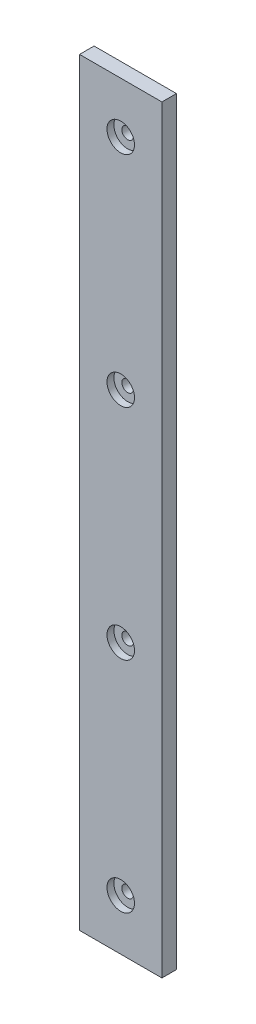
ISO-10303-21;
HEADER;
FILE_DESCRIPTION(('STEP AP214'),'2;1');
FILE_NAME('part.step','',(''),(''),'','','');
FILE_SCHEMA(('AUTOMOTIVE_DESIGN { 1 0 10303 214 1 1 1 1 }'));
ENDSEC;
DATA;
#1=APPLICATION_CONTEXT('core data for automotive mechanical design processes');
#2=APPLICATION_PROTOCOL_DEFINITION('international standard','automotive_design',2000,#1);
#3=PRODUCT_CONTEXT('',#1,'mechanical');
#4=PRODUCT('Part','Part','',(#3));
#5=PRODUCT_RELATED_PRODUCT_CATEGORY('part','',(#4));
#6=PRODUCT_DEFINITION_FORMATION('','',#4);
#7=PRODUCT_DEFINITION_CONTEXT('part definition',#1,'design');
#8=PRODUCT_DEFINITION('design','',#6,#7);
#9=PRODUCT_DEFINITION_SHAPE('','',#8);
#10=(LENGTH_UNIT() NAMED_UNIT(*) SI_UNIT(.MILLI.,.METRE.));
#11=(NAMED_UNIT(*) PLANE_ANGLE_UNIT() SI_UNIT($,.RADIAN.));
#12=(NAMED_UNIT(*) SI_UNIT($,.STERADIAN.) SOLID_ANGLE_UNIT());
#13=UNCERTAINTY_MEASURE_WITH_UNIT(LENGTH_MEASURE(1.E-05),#10,'distance_accuracy_value','');
#14=(GEOMETRIC_REPRESENTATION_CONTEXT(3) GLOBAL_UNCERTAINTY_ASSIGNED_CONTEXT((#13)) GLOBAL_UNIT_ASSIGNED_CONTEXT((#10,
#11,#12)) REPRESENTATION_CONTEXT('',''));
#15=CARTESIAN_POINT('',(0.,0.,0.));
#16=DIRECTION('',(0.,0.,1.));
#17=DIRECTION('',(1.,0.,0.));
#18=AXIS2_PLACEMENT_3D('',#15,#16,#17);
#19=CARTESIAN_POINT('',(0.,151.5,6.7));
#20=DIRECTION('',(0.,0.,-1.));
#21=DIRECTION('',(0.,1.,0.));
#22=AXIS2_PLACEMENT_3D('',#19,#20,#21);
#23=CYLINDRICAL_SURFACE('',#22,6.35);
#24=CARTESIAN_POINT('',(0.,151.5,3.5));
#25=DIRECTION('',(0.,0.,-1.));
#26=DIRECTION('',(0.,1.,0.));
#27=AXIS2_PLACEMENT_3D('',#24,#25,#26);
#28=CIRCLE('',#27,6.35);
#29=CARTESIAN_POINT('',(0.,157.85,3.5));
#30=VERTEX_POINT('',#29);
#31=EDGE_CURVE('E114',#30,#30,#28,.T.);
#32=ORIENTED_EDGE('',*,*,#31,.T.);
#33=EDGE_LOOP('',(#32));
#34=FACE_BOUND('',#33,.T.);
#35=CARTESIAN_POINT('',(0.,151.5,6.7));
#36=DIRECTION('',(0.,0.,-1.));
#37=DIRECTION('',(0.,1.,0.));
#38=AXIS2_PLACEMENT_3D('',#35,#36,#37);
#39=CIRCLE('',#38,6.35);
#40=CARTESIAN_POINT('',(0.,157.85,6.7));
#41=VERTEX_POINT('',#40);
#42=EDGE_CURVE('E19',#41,#41,#39,.T.);
#43=ORIENTED_EDGE('',*,*,#42,.F.);
#44=EDGE_LOOP('',(#43));
#45=FACE_BOUND('',#44,.T.);
#46=ADVANCED_FACE('F15',(#34,#45),#23,.F.);
#47=CARTESIAN_POINT('',(0.,50.5,6.7));
#48=DIRECTION('',(0.,0.,-1.));
#49=DIRECTION('',(-1.,0.,0.));
#50=AXIS2_PLACEMENT_3D('',#47,#48,#49);
#51=CYLINDRICAL_SURFACE('',#50,6.35);
#52=CARTESIAN_POINT('',(0.,50.5,3.5));
#53=DIRECTION('',(0.,0.,-1.));
#54=DIRECTION('',(-1.,0.,0.));
#55=AXIS2_PLACEMENT_3D('',#52,#53,#54);
#56=CIRCLE('',#55,6.35);
#57=CARTESIAN_POINT('',(-6.35000000000005,50.5,3.5));
#58=VERTEX_POINT('',#57);
#59=EDGE_CURVE('E111',#58,#58,#56,.T.);
#60=ORIENTED_EDGE('',*,*,#59,.T.);
#61=EDGE_LOOP('',(#60));
#62=FACE_BOUND('',#61,.T.);
#63=CARTESIAN_POINT('',(0.,50.5,6.7));
#64=DIRECTION('',(0.,0.,-1.));
#65=DIRECTION('',(-1.,0.,0.));
#66=AXIS2_PLACEMENT_3D('',#63,#64,#65);
#67=CIRCLE('',#66,6.35);
#68=CARTESIAN_POINT('',(-6.35000000000005,50.5,6.7));
#69=VERTEX_POINT('',#68);
#70=EDGE_CURVE('E122',#69,#69,#67,.T.);
#71=ORIENTED_EDGE('',*,*,#70,.F.);
#72=EDGE_LOOP('',(#71));
#73=FACE_BOUND('',#72,.T.);
#74=ADVANCED_FACE('F131',(#62,#73),#51,.F.);
#75=CARTESIAN_POINT('',(0.,-50.5,6.7));
#76=DIRECTION('',(0.,0.,-1.));
#77=DIRECTION('',(-1.,0.,0.));
#78=AXIS2_PLACEMENT_3D('',#75,#76,#77);
#79=CYLINDRICAL_SURFACE('',#78,6.35000000000001);
#80=CARTESIAN_POINT('',(0.,-50.5,3.5));
#81=DIRECTION('',(0.,0.,-1.));
#82=DIRECTION('',(-1.,0.,0.));
#83=AXIS2_PLACEMENT_3D('',#80,#81,#82);
#84=CIRCLE('',#83,6.35000000000001);
#85=CARTESIAN_POINT('',(-6.35000000000005,-50.5,3.5));
#86=VERTEX_POINT('',#85);
#87=EDGE_CURVE('E108',#86,#86,#84,.T.);
#88=ORIENTED_EDGE('',*,*,#87,.T.);
#89=EDGE_LOOP('',(#88));
#90=FACE_BOUND('',#89,.T.);
#91=CARTESIAN_POINT('',(0.,-50.5,6.7));
#92=DIRECTION('',(0.,0.,-1.));
#93=DIRECTION('',(-1.,0.,0.));
#94=AXIS2_PLACEMENT_3D('',#91,#92,#93);
#95=CIRCLE('',#94,6.35000000000001);
#96=CARTESIAN_POINT('',(-6.35000000000005,-50.5,6.7));
#97=VERTEX_POINT('',#96);
#98=EDGE_CURVE('E120',#97,#97,#95,.T.);
#99=ORIENTED_EDGE('',*,*,#98,.F.);
#100=EDGE_LOOP('',(#99));
#101=FACE_BOUND('',#100,.T.);
#102=ADVANCED_FACE('F138',(#90,#101),#79,.F.);
#103=CARTESIAN_POINT('',(0.,-151.5,6.7));
#104=DIRECTION('',(0.,0.,-1.));
#105=DIRECTION('',(0.,1.,0.));
#106=AXIS2_PLACEMENT_3D('',#103,#104,#105);
#107=CYLINDRICAL_SURFACE('',#106,6.34999999999999);
#108=CARTESIAN_POINT('',(0.,-151.5,3.5));
#109=DIRECTION('',(0.,0.,-1.));
#110=DIRECTION('',(0.,1.,0.));
#111=AXIS2_PLACEMENT_3D('',#108,#109,#110);
#112=CIRCLE('',#111,6.34999999999999);
#113=CARTESIAN_POINT('',(0.,-145.15,3.5));
#114=VERTEX_POINT('',#113);
#115=EDGE_CURVE('E75',#114,#114,#112,.T.);
#116=ORIENTED_EDGE('',*,*,#115,.T.);
#117=EDGE_LOOP('',(#116));
#118=FACE_BOUND('',#117,.T.);
#119=CARTESIAN_POINT('',(0.,-151.5,6.7));
#120=DIRECTION('',(0.,0.,-1.));
#121=DIRECTION('',(0.,1.,0.));
#122=AXIS2_PLACEMENT_3D('',#119,#120,#121);
#123=CIRCLE('',#122,6.34999999999999);
#124=CARTESIAN_POINT('',(0.,-145.15,6.7));
#125=VERTEX_POINT('',#124);
#126=EDGE_CURVE('E117',#125,#125,#123,.T.);
#127=ORIENTED_EDGE('',*,*,#126,.F.);
#128=EDGE_LOOP('',(#127));
#129=FACE_BOUND('',#128,.T.);
#130=ADVANCED_FACE('F167',(#118,#129),#107,.F.);
#131=CARTESIAN_POINT('',(0.,0.,6.7));
#132=DIRECTION('',(0.,0.,1.));
#133=DIRECTION('',(1.,0.,0.));
#134=AXIS2_PLACEMENT_3D('',#131,#132,#133);
#135=PLANE('',#134);
#136=ORIENTED_EDGE('',*,*,#126,.T.);
#137=EDGE_LOOP('',(#136));
#138=FACE_BOUND('',#137,.T.);
#139=ORIENTED_EDGE('',*,*,#98,.T.);
#140=EDGE_LOOP('',(#139));
#141=FACE_BOUND('',#140,.T.);
#142=ORIENTED_EDGE('',*,*,#70,.T.);
#143=EDGE_LOOP('',(#142));
#144=FACE_BOUND('',#143,.T.);
#145=ORIENTED_EDGE('',*,*,#42,.T.);
#146=EDGE_LOOP('',(#145));
#147=FACE_BOUND('',#146,.T.);
#148=DIRECTION('',(0.,1.,0.));
#149=VECTOR('',#148,1.);
#150=CARTESIAN_POINT('',(18.9999999999999,175.,6.7));
#151=LINE('',#150,#149);
#152=CARTESIAN_POINT('',(19.,175.,6.7));
#153=VERTEX_POINT('',#152);
#154=CARTESIAN_POINT('',(19.,-175.,6.7));
#155=VERTEX_POINT('',#154);
#156=EDGE_CURVE('E67',#153,#155,#151,.F.);
#157=ORIENTED_EDGE('',*,*,#156,.F.);
#158=DIRECTION('',(1.,0.,0.));
#159=VECTOR('',#158,1.);
#160=CARTESIAN_POINT('',(-19.,175.,6.7));
#161=LINE('',#160,#159);
#162=CARTESIAN_POINT('',(-19.,175.,6.7));
#163=VERTEX_POINT('',#162);
#164=EDGE_CURVE('E58',#163,#153,#161,.T.);
#165=ORIENTED_EDGE('',*,*,#164,.F.);
#166=DIRECTION('',(0.,1.,0.));
#167=VECTOR('',#166,1.);
#168=CARTESIAN_POINT('',(-19.,-175.,6.7));
#169=LINE('',#168,#167);
#170=CARTESIAN_POINT('',(-19.,-175.,6.7));
#171=VERTEX_POINT('',#170);
#172=EDGE_CURVE('E53',#171,#163,#169,.T.);
#173=ORIENTED_EDGE('',*,*,#172,.F.);
#174=DIRECTION('',(1.,0.,0.));
#175=VECTOR('',#174,1.);
#176=CARTESIAN_POINT('',(19.,-175.,6.7));
#177=LINE('',#176,#175);
#178=EDGE_CURVE('E71',#155,#171,#177,.F.);
#179=ORIENTED_EDGE('',*,*,#178,.F.);
#180=EDGE_LOOP('',(#157,#165,#173,#179));
#181=FACE_BOUND('',#180,.T.);
#182=ADVANCED_FACE('F70',(#138,#141,#144,#147,#181),#135,.T.);
#183=CARTESIAN_POINT('',(-6.47700000000005,157.977,3.5));
#184=DIRECTION('',(0.,0.,-1.));
#185=DIRECTION('',(1.,0.,0.));
#186=AXIS2_PLACEMENT_3D('',#183,#184,#185);
#187=PLANE('',#186);
#188=CARTESIAN_POINT('',(0.,151.5,3.5));
#189=DIRECTION('',(0.,0.,-1.));
#190=DIRECTION('',(0.,1.,0.));
#191=AXIS2_PLACEMENT_3D('',#188,#189,#190);
#192=CIRCLE('',#191,2.69999999999999);
#193=CARTESIAN_POINT('',(0.,154.2,3.5));
#194=VERTEX_POINT('',#193);
#195=EDGE_CURVE('E102',#194,#194,#192,.T.);
#196=ORIENTED_EDGE('',*,*,#195,.T.);
#197=EDGE_LOOP('',(#196));
#198=FACE_BOUND('',#197,.T.);
#199=ORIENTED_EDGE('',*,*,#31,.F.);
#200=EDGE_LOOP('',(#199));
#201=FACE_BOUND('',#200,.T.);
#202=ADVANCED_FACE('F166',(#198,#201),#187,.F.);
#203=CARTESIAN_POINT('',(-6.47700000000005,56.977,3.5));
#204=DIRECTION('',(0.,0.,-1.));
#205=DIRECTION('',(1.,0.,0.));
#206=AXIS2_PLACEMENT_3D('',#203,#204,#205);
#207=PLANE('',#206);
#208=CARTESIAN_POINT('',(0.,50.5,3.5));
#209=DIRECTION('',(0.,0.,-1.));
#210=DIRECTION('',(-1.,0.,0.));
#211=AXIS2_PLACEMENT_3D('',#208,#209,#210);
#212=CIRCLE('',#211,2.7);
#213=CARTESIAN_POINT('',(-2.70000000000006,50.5,3.5));
#214=VERTEX_POINT('',#213);
#215=EDGE_CURVE('E99',#214,#214,#212,.T.);
#216=ORIENTED_EDGE('',*,*,#215,.T.);
#217=EDGE_LOOP('',(#216));
#218=FACE_BOUND('',#217,.T.);
#219=ORIENTED_EDGE('',*,*,#59,.F.);
#220=EDGE_LOOP('',(#219));
#221=FACE_BOUND('',#220,.T.);
#222=ADVANCED_FACE('F173',(#218,#221),#207,.F.);
#223=CARTESIAN_POINT('',(-6.47700000000005,-44.023,3.5));
#224=DIRECTION('',(0.,0.,-1.));
#225=DIRECTION('',(1.,0.,0.));
#226=AXIS2_PLACEMENT_3D('',#223,#224,#225);
#227=PLANE('',#226);
#228=CARTESIAN_POINT('',(0.,-50.5,3.5));
#229=DIRECTION('',(0.,0.,-1.));
#230=DIRECTION('',(-1.,0.,0.));
#231=AXIS2_PLACEMENT_3D('',#228,#229,#230);
#232=CIRCLE('',#231,2.70000000000001);
#233=CARTESIAN_POINT('',(-2.70000000000005,-50.5,3.5));
#234=VERTEX_POINT('',#233);
#235=EDGE_CURVE('E96',#234,#234,#232,.T.);
#236=ORIENTED_EDGE('',*,*,#235,.T.);
#237=EDGE_LOOP('',(#236));
#238=FACE_BOUND('',#237,.T.);
#239=ORIENTED_EDGE('',*,*,#87,.F.);
#240=EDGE_LOOP('',(#239));
#241=FACE_BOUND('',#240,.T.);
#242=ADVANCED_FACE('F190',(#238,#241),#227,.F.);
#243=CARTESIAN_POINT('',(-6.47700000000005,-145.023,3.5));
#244=DIRECTION('',(0.,0.,-1.));
#245=DIRECTION('',(1.,0.,0.));
#246=AXIS2_PLACEMENT_3D('',#243,#244,#245);
#247=PLANE('',#246);
#248=CARTESIAN_POINT('',(0.,-151.5,3.5));
#249=DIRECTION('',(0.,0.,-1.));
#250=DIRECTION('',(-1.,0.,0.));
#251=AXIS2_PLACEMENT_3D('',#248,#249,#250);
#252=CIRCLE('',#251,2.70000000000001);
#253=CARTESIAN_POINT('',(-2.70000000000006,-151.5,3.5));
#254=VERTEX_POINT('',#253);
#255=EDGE_CURVE('E93',#254,#254,#252,.T.);
#256=ORIENTED_EDGE('',*,*,#255,.T.);
#257=EDGE_LOOP('',(#256));
#258=FACE_BOUND('',#257,.T.);
#259=ORIENTED_EDGE('',*,*,#115,.F.);
#260=EDGE_LOOP('',(#259));
#261=FACE_BOUND('',#260,.T.);
#262=ADVANCED_FACE('F164',(#258,#261),#247,.F.);
#263=CARTESIAN_POINT('',(18.9999999999999,175.,0.));
#264=DIRECTION('',(1.,0.,0.));
#265=DIRECTION('',(0.,0.,-1.));
#266=AXIS2_PLACEMENT_3D('',#263,#264,#265);
#267=PLANE('',#266);
#268=DIRECTION('',(0.,1.,0.));
#269=VECTOR('',#268,1.);
#270=CARTESIAN_POINT('',(19.,0.,0.));
#271=LINE('',#270,#269);
#272=CARTESIAN_POINT('',(19.,-175.,0.));
#273=VERTEX_POINT('',#272);
#274=CARTESIAN_POINT('',(19.,175.,0.));
#275=VERTEX_POINT('',#274);
#276=EDGE_CURVE('E79',#273,#275,#271,.T.);
#277=ORIENTED_EDGE('',*,*,#276,.T.);
#278=DIRECTION('',(0.,0.,1.));
#279=VECTOR('',#278,1.);
#280=CARTESIAN_POINT('',(18.9999999999999,175.,0.));
#281=LINE('',#280,#279);
#282=EDGE_CURVE('E63',#153,#275,#281,.F.);
#283=ORIENTED_EDGE('',*,*,#282,.F.);
#284=ORIENTED_EDGE('',*,*,#156,.T.);
#285=DIRECTION('',(0.,0.,-1.));
#286=VECTOR('',#285,1.);
#287=CARTESIAN_POINT('',(19.,-175.,0.));
#288=LINE('',#287,#286);
#289=EDGE_CURVE('E105',#273,#155,#288,.F.);
#290=ORIENTED_EDGE('',*,*,#289,.F.);
#291=EDGE_LOOP('',(#277,#283,#284,#290));
#292=FACE_BOUND('',#291,.T.);
#293=ADVANCED_FACE('F78',(#292),#267,.T.);
#294=CARTESIAN_POINT('',(-19.,175.,0.));
#295=DIRECTION('',(0.,1.,0.));
#296=DIRECTION('',(0.,0.,1.));
#297=AXIS2_PLACEMENT_3D('',#294,#295,#296);
#298=PLANE('',#297);
#299=DIRECTION('',(1.,0.,0.));
#300=VECTOR('',#299,1.);
#301=CARTESIAN_POINT('',(0.,175.,0.));
#302=LINE('',#301,#300);
#303=CARTESIAN_POINT('',(-19.,175.,0.));
#304=VERTEX_POINT('',#303);
#305=EDGE_CURVE('E219',#275,#304,#302,.F.);
#306=ORIENTED_EDGE('',*,*,#305,.T.);
#307=DIRECTION('',(0.,0.,1.));
#308=VECTOR('',#307,1.);
#309=CARTESIAN_POINT('',(-19.,175.,0.));
#310=LINE('',#309,#308);
#311=EDGE_CURVE('E65',#163,#304,#310,.F.);
#312=ORIENTED_EDGE('',*,*,#311,.F.);
#313=ORIENTED_EDGE('',*,*,#164,.T.);
#314=ORIENTED_EDGE('',*,*,#282,.T.);
#315=EDGE_LOOP('',(#306,#312,#313,#314));
#316=FACE_BOUND('',#315,.T.);
#317=ADVANCED_FACE('F61',(#316),#298,.T.);
#318=CARTESIAN_POINT('',(-19.,-175.,0.));
#319=DIRECTION('',(-1.,0.,0.));
#320=DIRECTION('',(0.,0.,1.));
#321=AXIS2_PLACEMENT_3D('',#318,#319,#320);
#322=PLANE('',#321);
#323=DIRECTION('',(0.,1.,0.));
#324=VECTOR('',#323,1.);
#325=CARTESIAN_POINT('',(-19.,0.,0.));
#326=LINE('',#325,#324);
#327=CARTESIAN_POINT('',(-19.,-175.,0.));
#328=VERTEX_POINT('',#327);
#329=EDGE_CURVE('E218',#304,#328,#326,.F.);
#330=ORIENTED_EDGE('',*,*,#329,.T.);
#331=DIRECTION('',(0.,0.,-1.));
#332=VECTOR('',#331,1.);
#333=CARTESIAN_POINT('',(-19.,-175.,0.));
#334=LINE('',#333,#332);
#335=EDGE_CURVE('E34',#171,#328,#334,.T.);
#336=ORIENTED_EDGE('',*,*,#335,.F.);
#337=ORIENTED_EDGE('',*,*,#172,.T.);
#338=ORIENTED_EDGE('',*,*,#311,.T.);
#339=EDGE_LOOP('',(#330,#336,#337,#338));
#340=FACE_BOUND('',#339,.T.);
#341=ADVANCED_FACE('F158',(#340),#322,.T.);
#342=CARTESIAN_POINT('',(19.,-175.,0.));
#343=DIRECTION('',(0.,-1.,0.));
#344=DIRECTION('',(0.,0.,-1.));
#345=AXIS2_PLACEMENT_3D('',#342,#343,#344);
#346=PLANE('',#345);
#347=DIRECTION('',(1.,0.,0.));
#348=VECTOR('',#347,1.);
#349=CARTESIAN_POINT('',(0.,-175.,0.));
#350=LINE('',#349,#348);
#351=EDGE_CURVE('E92',#328,#273,#350,.T.);
#352=ORIENTED_EDGE('',*,*,#351,.T.);
#353=ORIENTED_EDGE('',*,*,#289,.T.);
#354=ORIENTED_EDGE('',*,*,#178,.T.);
#355=ORIENTED_EDGE('',*,*,#335,.T.);
#356=EDGE_LOOP('',(#352,#353,#354,#355));
#357=FACE_BOUND('',#356,.T.);
#358=ADVANCED_FACE('F154',(#357),#346,.T.);
#359=CARTESIAN_POINT('',(0.,151.5,3.5));
#360=DIRECTION('',(0.,0.,-1.));
#361=DIRECTION('',(0.,1.,0.));
#362=AXIS2_PLACEMENT_3D('',#359,#360,#361);
#363=CYLINDRICAL_SURFACE('',#362,2.69999999999999);
#364=ORIENTED_EDGE('',*,*,#195,.F.);
#365=EDGE_LOOP('',(#364));
#366=FACE_BOUND('',#365,.T.);
#367=CARTESIAN_POINT('',(0.,151.5,0.));
#368=DIRECTION('',(0.,0.,-1.));
#369=DIRECTION('',(0.,1.,0.));
#370=AXIS2_PLACEMENT_3D('',#367,#368,#369);
#371=CIRCLE('',#370,2.69999999999999);
#372=CARTESIAN_POINT('',(0.,154.2,0.));
#373=VERTEX_POINT('',#372);
#374=EDGE_CURVE('E89',#373,#373,#371,.T.);
#375=ORIENTED_EDGE('',*,*,#374,.T.);
#376=EDGE_LOOP('',(#375));
#377=FACE_BOUND('',#376,.T.);
#378=ADVANCED_FACE('F157',(#366,#377),#363,.F.);
#379=CARTESIAN_POINT('',(0.,50.5,3.5));
#380=DIRECTION('',(0.,0.,-1.));
#381=DIRECTION('',(-1.,0.,0.));
#382=AXIS2_PLACEMENT_3D('',#379,#380,#381);
#383=CYLINDRICAL_SURFACE('',#382,2.7);
#384=ORIENTED_EDGE('',*,*,#215,.F.);
#385=EDGE_LOOP('',(#384));
#386=FACE_BOUND('',#385,.T.);
#387=CARTESIAN_POINT('',(0.,50.5,0.));
#388=DIRECTION('',(0.,0.,-1.));
#389=DIRECTION('',(-1.,0.,0.));
#390=AXIS2_PLACEMENT_3D('',#387,#388,#389);
#391=CIRCLE('',#390,2.7);
#392=CARTESIAN_POINT('',(-2.70000000000006,50.5,0.));
#393=VERTEX_POINT('',#392);
#394=EDGE_CURVE('E86',#393,#393,#391,.T.);
#395=ORIENTED_EDGE('',*,*,#394,.T.);
#396=EDGE_LOOP('',(#395));
#397=FACE_BOUND('',#396,.T.);
#398=ADVANCED_FACE('F200',(#386,#397),#383,.F.);
#399=CARTESIAN_POINT('',(0.,-50.5,3.5));
#400=DIRECTION('',(0.,0.,-1.));
#401=DIRECTION('',(-1.,0.,0.));
#402=AXIS2_PLACEMENT_3D('',#399,#400,#401);
#403=CYLINDRICAL_SURFACE('',#402,2.70000000000001);
#404=ORIENTED_EDGE('',*,*,#235,.F.);
#405=EDGE_LOOP('',(#404));
#406=FACE_BOUND('',#405,.T.);
#407=CARTESIAN_POINT('',(0.,-50.5,0.));
#408=DIRECTION('',(0.,0.,-1.));
#409=DIRECTION('',(-1.,0.,0.));
#410=AXIS2_PLACEMENT_3D('',#407,#408,#409);
#411=CIRCLE('',#410,2.70000000000001);
#412=CARTESIAN_POINT('',(-2.70000000000005,-50.5,0.));
#413=VERTEX_POINT('',#412);
#414=EDGE_CURVE('E25',#413,#413,#411,.T.);
#415=ORIENTED_EDGE('',*,*,#414,.T.);
#416=EDGE_LOOP('',(#415));
#417=FACE_BOUND('',#416,.T.);
#418=ADVANCED_FACE('F149',(#406,#417),#403,.F.);
#419=CARTESIAN_POINT('',(0.,-151.5,3.5));
#420=DIRECTION('',(0.,0.,-1.));
#421=DIRECTION('',(-1.,0.,0.));
#422=AXIS2_PLACEMENT_3D('',#419,#420,#421);
#423=CYLINDRICAL_SURFACE('',#422,2.70000000000001);
#424=ORIENTED_EDGE('',*,*,#255,.F.);
#425=EDGE_LOOP('',(#424));
#426=FACE_BOUND('',#425,.T.);
#427=CARTESIAN_POINT('',(0.,-151.5,0.));
#428=DIRECTION('',(0.,0.,-1.));
#429=DIRECTION('',(-1.,0.,0.));
#430=AXIS2_PLACEMENT_3D('',#427,#428,#429);
#431=CIRCLE('',#430,2.70000000000001);
#432=CARTESIAN_POINT('',(-2.70000000000006,-151.5,0.));
#433=VERTEX_POINT('',#432);
#434=EDGE_CURVE('E9',#433,#433,#431,.T.);
#435=ORIENTED_EDGE('',*,*,#434,.T.);
#436=EDGE_LOOP('',(#435));
#437=FACE_BOUND('',#436,.T.);
#438=ADVANCED_FACE('F17',(#426,#437),#423,.F.);
#439=CARTESIAN_POINT('',(0.,0.,0.));
#440=DIRECTION('',(0.,0.,1.));
#441=DIRECTION('',(1.,0.,0.));
#442=AXIS2_PLACEMENT_3D('',#439,#440,#441);
#443=PLANE('',#442);
#444=ORIENTED_EDGE('',*,*,#434,.F.);
#445=EDGE_LOOP('',(#444));
#446=FACE_BOUND('',#445,.T.);
#447=ORIENTED_EDGE('',*,*,#414,.F.);
#448=EDGE_LOOP('',(#447));
#449=FACE_BOUND('',#448,.T.);
#450=ORIENTED_EDGE('',*,*,#394,.F.);
#451=EDGE_LOOP('',(#450));
#452=FACE_BOUND('',#451,.T.);
#453=ORIENTED_EDGE('',*,*,#374,.F.);
#454=EDGE_LOOP('',(#453));
#455=FACE_BOUND('',#454,.T.);
#456=ORIENTED_EDGE('',*,*,#329,.F.);
#457=ORIENTED_EDGE('',*,*,#305,.F.);
#458=ORIENTED_EDGE('',*,*,#276,.F.);
#459=ORIENTED_EDGE('',*,*,#351,.F.);
#460=EDGE_LOOP('',(#456,#457,#458,#459));
#461=FACE_BOUND('',#460,.T.);
#462=ADVANCED_FACE('F142',(#446,#449,#452,#455,#461),#443,.F.);
#463=CLOSED_SHELL('',(#46,#74,#102,#130,#182,#202,#222,#242,#262,#293,#317,#341,#358,#378,#398,
#418,#438,#462));
#464=MANIFOLD_SOLID_BREP('B1',#463);
#465=ADVANCED_BREP_SHAPE_REPRESENTATION('',(#18,#464),#14);
#466=SHAPE_DEFINITION_REPRESENTATION(#9,#465);
ENDSEC;
END-ISO-10303-21;
